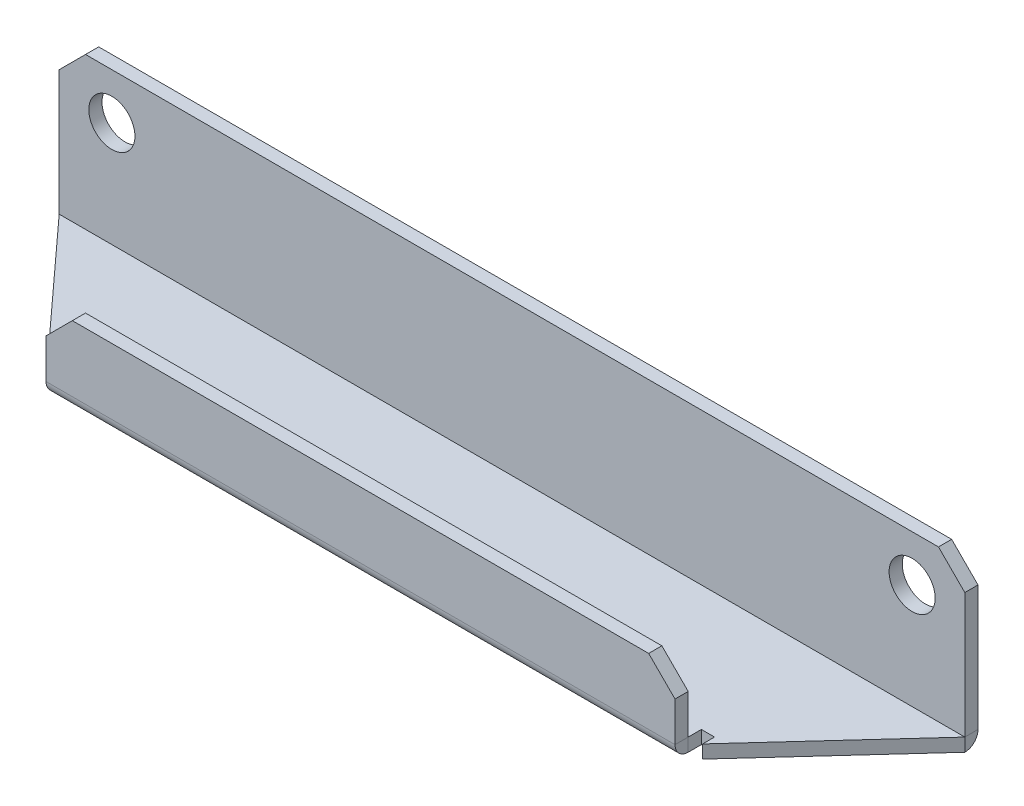
ISO-10303-21;
HEADER;
FILE_DESCRIPTION(('STEP AP214'),'2;1');
FILE_NAME('part.step','',(''),(''),'','','');
FILE_SCHEMA(('AUTOMOTIVE_DESIGN { 1 0 10303 214 1 1 1 1 }'));
ENDSEC;
DATA;
#1=APPLICATION_CONTEXT('core data for automotive mechanical design processes');
#2=APPLICATION_PROTOCOL_DEFINITION('international standard','automotive_design',2000,#1);
#3=PRODUCT_CONTEXT('',#1,'mechanical');
#4=PRODUCT('Part','Part','',(#3));
#5=PRODUCT_RELATED_PRODUCT_CATEGORY('part','',(#4));
#6=PRODUCT_DEFINITION_FORMATION('','',#4);
#7=PRODUCT_DEFINITION_CONTEXT('part definition',#1,'design');
#8=PRODUCT_DEFINITION('design','',#6,#7);
#9=PRODUCT_DEFINITION_SHAPE('','',#8);
#10=(LENGTH_UNIT() NAMED_UNIT(*) SI_UNIT(.MILLI.,.METRE.));
#11=(NAMED_UNIT(*) PLANE_ANGLE_UNIT() SI_UNIT($,.RADIAN.));
#12=(NAMED_UNIT(*) SI_UNIT($,.STERADIAN.) SOLID_ANGLE_UNIT());
#13=UNCERTAINTY_MEASURE_WITH_UNIT(LENGTH_MEASURE(1.E-05),#10,'distance_accuracy_value','');
#14=(GEOMETRIC_REPRESENTATION_CONTEXT(3) GLOBAL_UNCERTAINTY_ASSIGNED_CONTEXT((#13)) GLOBAL_UNIT_ASSIGNED_CONTEXT((#10,
#11,#12)) REPRESENTATION_CONTEXT('',''));
#15=CARTESIAN_POINT('',(0.,0.,0.));
#16=DIRECTION('',(0.,0.,1.));
#17=DIRECTION('',(1.,0.,0.));
#18=AXIS2_PLACEMENT_3D('',#15,#16,#17);
#19=CARTESIAN_POINT('',(-68.75,0.,0.));
#20=DIRECTION('',(0.738485493928126,0.,-0.674269364021332));
#21=DIRECTION('',(-0.674269364021332,0.,-0.738485493928126));
#22=AXIS2_PLACEMENT_3D('',#19,#20,#21);
#23=PLANE('',#22);
#24=DIRECTION('',(0.,-1.,0.));
#25=VECTOR('',#24,1.);
#26=CARTESIAN_POINT('',(-49.75,1.99999999999993,20.8095238095238));
#27=LINE('',#26,#25);
#28=CARTESIAN_POINT('',(-49.75,1.99999999999993,20.8095238095238));
#29=VERTEX_POINT('',#28);
#30=CARTESIAN_POINT('',(-49.75,0.,20.8095238095238));
#31=VERTEX_POINT('',#30);
#32=EDGE_CURVE('E310',#29,#31,#27,.T.);
#33=ORIENTED_EDGE('',*,*,#32,.F.);
#34=DIRECTION('',(-0.674269364021332,0.,-0.738485493928126));
#35=VECTOR('',#34,1.);
#36=CARTESIAN_POINT('',(-68.75,2.,0.));
#37=LINE('',#36,#35);
#38=CARTESIAN_POINT('',(-68.75,2.,0.));
#39=VERTEX_POINT('',#38);
#40=EDGE_CURVE('E331',#29,#39,#37,.T.);
#41=ORIENTED_EDGE('',*,*,#40,.T.);
#42=DIRECTION('',(0.,1.,0.));
#43=VECTOR('',#42,1.);
#44=CARTESIAN_POINT('',(-68.75,0.,0.));
#45=LINE('',#44,#43);
#46=CARTESIAN_POINT('',(-68.75,0.,0.));
#47=VERTEX_POINT('',#46);
#48=EDGE_CURVE('E332',#47,#39,#45,.T.);
#49=ORIENTED_EDGE('',*,*,#48,.F.);
#50=DIRECTION('',(0.674269364021332,0.,0.738485493928126));
#51=VECTOR('',#50,1.);
#52=CARTESIAN_POINT('',(-37.4935567010309,-1.19524744544288E-13,34.2332474226804));
#53=LINE('',#52,#51);
#54=EDGE_CURVE('E344',#31,#47,#53,.F.);
#55=ORIENTED_EDGE('',*,*,#54,.F.);
#56=EDGE_LOOP('',(#33,#41,#49,#55));
#57=FACE_BOUND('',#56,.T.);
#58=ADVANCED_FACE('F85',(#57),#23,.F.);
#59=CARTESIAN_POINT('',(68.75,0.,0.));
#60=DIRECTION('',(-0.738485493928126,0.,-0.674269364021332));
#61=DIRECTION('',(-0.674269364021332,0.,0.738485493928126));
#62=AXIS2_PLACEMENT_3D('',#59,#60,#61);
#63=PLANE('',#62);
#64=DIRECTION('',(0.,-1.,0.));
#65=VECTOR('',#64,1.);
#66=CARTESIAN_POINT('',(49.75,1.99999999999993,20.8095238095238));
#67=LINE('',#66,#65);
#68=CARTESIAN_POINT('',(49.75,1.99999999999993,20.8095238095238));
#69=VERTEX_POINT('',#68);
#70=CARTESIAN_POINT('',(49.75,0.,20.8095238095238));
#71=VERTEX_POINT('',#70);
#72=EDGE_CURVE('E291',#69,#71,#67,.T.);
#73=ORIENTED_EDGE('',*,*,#72,.T.);
#74=DIRECTION('',(0.674269364021332,0.,-0.738485493928126));
#75=VECTOR('',#74,1.);
#76=CARTESIAN_POINT('',(37.4935567010309,-1.19524744544288E-13,34.2332474226804));
#77=LINE('',#76,#75);
#78=CARTESIAN_POINT('',(68.75,0.,0.));
#79=VERTEX_POINT('',#78);
#80=EDGE_CURVE('E339',#79,#71,#77,.F.);
#81=ORIENTED_EDGE('',*,*,#80,.F.);
#82=DIRECTION('',(0.,1.,0.));
#83=VECTOR('',#82,1.);
#84=CARTESIAN_POINT('',(68.75,0.,0.));
#85=LINE('',#84,#83);
#86=CARTESIAN_POINT('',(68.75,2.,0.));
#87=VERTEX_POINT('',#86);
#88=EDGE_CURVE('E336',#79,#87,#85,.T.);
#89=ORIENTED_EDGE('',*,*,#88,.T.);
#90=DIRECTION('',(-0.674269364021332,0.,0.738485493928126));
#91=VECTOR('',#90,1.);
#92=CARTESIAN_POINT('',(68.75,2.,0.));
#93=LINE('',#92,#91);
#94=EDGE_CURVE('E346',#87,#69,#93,.T.);
#95=ORIENTED_EDGE('',*,*,#94,.T.);
#96=EDGE_LOOP('',(#73,#81,#89,#95));
#97=FACE_BOUND('',#96,.T.);
#98=ADVANCED_FACE('F426',(#97),#63,.F.);
#99=CARTESIAN_POINT('',(0.,0.,0.));
#100=DIRECTION('',(0.,-1.,0.));
#101=DIRECTION('',(0.,0.,-1.));
#102=AXIS2_PLACEMENT_3D('',#99,#100,#101);
#103=PLANE('',#102);
#104=ORIENTED_EDGE('',*,*,#80,.T.);
#105=DIRECTION('',(0.,0.,-1.));
#106=VECTOR('',#105,1.);
#107=CARTESIAN_POINT('',(49.75,0.,0.));
#108=LINE('',#107,#106);
#109=CARTESIAN_POINT('',(49.75,0.,19.));
#110=VERTEX_POINT('',#109);
#111=EDGE_CURVE('E102',#71,#110,#108,.T.);
#112=ORIENTED_EDGE('',*,*,#111,.T.);
#113=DIRECTION('',(-1.,0.,0.));
#114=VECTOR('',#113,1.);
#115=CARTESIAN_POINT('',(0.,0.,19.));
#116=LINE('',#115,#114);
#117=CARTESIAN_POINT('',(47.75,0.,19.));
#118=VERTEX_POINT('',#117);
#119=EDGE_CURVE('E106',#110,#118,#116,.T.);
#120=ORIENTED_EDGE('',*,*,#119,.T.);
#121=DIRECTION('',(0.,0.,1.));
#122=VECTOR('',#121,1.);
#123=CARTESIAN_POINT('',(47.75,0.,0.));
#124=LINE('',#123,#122);
#125=CARTESIAN_POINT('',(47.75,0.,21.));
#126=VERTEX_POINT('',#125);
#127=EDGE_CURVE('E327',#118,#126,#124,.T.);
#128=ORIENTED_EDGE('',*,*,#127,.T.);
#129=DIRECTION('',(1.,0.,0.));
#130=VECTOR('',#129,1.);
#131=CARTESIAN_POINT('',(0.,0.,21.));
#132=LINE('',#131,#130);
#133=CARTESIAN_POINT('',(-47.75,0.,21.));
#134=VERTEX_POINT('',#133);
#135=EDGE_CURVE('E275',#134,#126,#132,.T.);
#136=ORIENTED_EDGE('',*,*,#135,.F.);
#137=DIRECTION('',(0.,0.,-1.));
#138=VECTOR('',#137,1.);
#139=CARTESIAN_POINT('',(-47.75,0.,0.));
#140=LINE('',#139,#138);
#141=CARTESIAN_POINT('',(-47.75,0.,19.));
#142=VERTEX_POINT('',#141);
#143=EDGE_CURVE('E325',#134,#142,#140,.T.);
#144=ORIENTED_EDGE('',*,*,#143,.T.);
#145=DIRECTION('',(-1.,0.,0.));
#146=VECTOR('',#145,1.);
#147=CARTESIAN_POINT('',(0.,0.,19.));
#148=LINE('',#147,#146);
#149=CARTESIAN_POINT('',(-49.75,0.,19.));
#150=VERTEX_POINT('',#149);
#151=EDGE_CURVE('E323',#142,#150,#148,.T.);
#152=ORIENTED_EDGE('',*,*,#151,.T.);
#153=DIRECTION('',(0.,0.,1.));
#154=VECTOR('',#153,1.);
#155=CARTESIAN_POINT('',(-49.75,0.,0.));
#156=LINE('',#155,#154);
#157=EDGE_CURVE('E290',#150,#31,#156,.T.);
#158=ORIENTED_EDGE('',*,*,#157,.T.);
#159=ORIENTED_EDGE('',*,*,#54,.T.);
#160=DIRECTION('',(-1.,0.,0.));
#161=VECTOR('',#160,1.);
#162=CARTESIAN_POINT('',(0.,0.,0.));
#163=LINE('',#162,#161);
#164=EDGE_CURVE('E341',#47,#79,#163,.F.);
#165=ORIENTED_EDGE('',*,*,#164,.T.);
#166=EDGE_LOOP('',(#104,#112,#120,#128,#136,#144,#152,#158,#159,#165));
#167=FACE_BOUND('',#166,.T.);
#168=ADVANCED_FACE('F434',(#167),#103,.T.);
#169=CARTESIAN_POINT('',(0.,2.,0.));
#170=DIRECTION('',(0.,-1.,0.));
#171=DIRECTION('',(0.,0.,-1.));
#172=AXIS2_PLACEMENT_3D('',#169,#170,#171);
#173=PLANE('',#172);
#174=DIRECTION('',(0.,0.,-1.));
#175=VECTOR('',#174,1.);
#176=CARTESIAN_POINT('',(49.75,1.99999999999993,20.8095238095238));
#177=LINE('',#176,#175);
#178=CARTESIAN_POINT('',(49.75,1.99999999999993,19.));
#179=VERTEX_POINT('',#178);
#180=EDGE_CURVE('E287',#69,#179,#177,.T.);
#181=ORIENTED_EDGE('',*,*,#180,.F.);
#182=ORIENTED_EDGE('',*,*,#94,.F.);
#183=DIRECTION('',(1.,0.,0.));
#184=VECTOR('',#183,1.);
#185=CARTESIAN_POINT('',(-68.75,2.,0.));
#186=LINE('',#185,#184);
#187=EDGE_CURVE('E349',#39,#87,#186,.T.);
#188=ORIENTED_EDGE('',*,*,#187,.F.);
#189=ORIENTED_EDGE('',*,*,#40,.F.);
#190=DIRECTION('',(0.,0.,1.));
#191=VECTOR('',#190,1.);
#192=CARTESIAN_POINT('',(-49.75,1.99999999999993,19.));
#193=LINE('',#192,#191);
#194=CARTESIAN_POINT('',(-49.75,1.99999999999993,19.));
#195=VERTEX_POINT('',#194);
#196=EDGE_CURVE('E307',#195,#29,#193,.T.);
#197=ORIENTED_EDGE('',*,*,#196,.F.);
#198=DIRECTION('',(-1.,0.,0.));
#199=VECTOR('',#198,1.);
#200=CARTESIAN_POINT('',(-47.75,1.99999999999993,19.));
#201=LINE('',#200,#199);
#202=CARTESIAN_POINT('',(-47.75,1.99999999999993,19.));
#203=VERTEX_POINT('',#202);
#204=EDGE_CURVE('E303',#203,#195,#201,.T.);
#205=ORIENTED_EDGE('',*,*,#204,.F.);
#206=DIRECTION('',(0.,0.,-1.));
#207=VECTOR('',#206,1.);
#208=CARTESIAN_POINT('',(-47.75,1.99999999999993,21.));
#209=LINE('',#208,#207);
#210=CARTESIAN_POINT('',(-47.75,1.99999999999993,21.));
#211=VERTEX_POINT('',#210);
#212=EDGE_CURVE('E300',#211,#203,#209,.T.);
#213=ORIENTED_EDGE('',*,*,#212,.F.);
#214=DIRECTION('',(-1.,0.,0.));
#215=VECTOR('',#214,1.);
#216=CARTESIAN_POINT('',(47.75,1.99999999999993,21.));
#217=LINE('',#216,#215);
#218=CARTESIAN_POINT('',(47.75,1.99999999999993,21.));
#219=VERTEX_POINT('',#218);
#220=EDGE_CURVE('E260',#211,#219,#217,.F.);
#221=ORIENTED_EDGE('',*,*,#220,.T.);
#222=DIRECTION('',(0.,0.,1.));
#223=VECTOR('',#222,1.);
#224=CARTESIAN_POINT('',(47.75,1.99999999999993,19.));
#225=LINE('',#224,#223);
#226=CARTESIAN_POINT('',(47.75,1.99999999999993,19.));
#227=VERTEX_POINT('',#226);
#228=EDGE_CURVE('E296',#227,#219,#225,.T.);
#229=ORIENTED_EDGE('',*,*,#228,.F.);
#230=DIRECTION('',(-1.,0.,0.));
#231=VECTOR('',#230,1.);
#232=CARTESIAN_POINT('',(49.75,1.99999999999993,19.));
#233=LINE('',#232,#231);
#234=EDGE_CURVE('E292',#179,#227,#233,.T.);
#235=ORIENTED_EDGE('',*,*,#234,.F.);
#236=EDGE_LOOP('',(#181,#182,#188,#189,#197,#205,#213,#221,#229,#235));
#237=FACE_BOUND('',#236,.T.);
#238=ADVANCED_FACE('F430',(#237),#173,.F.);
#239=CARTESIAN_POINT('',(68.75,0.,-2.));
#240=DIRECTION('',(1.,0.,0.));
#241=DIRECTION('',(0.,0.,-1.));
#242=AXIS2_PLACEMENT_3D('',#239,#240,#241);
#243=PLANE('',#242);
#244=DIRECTION('',(0.,1.,0.));
#245=VECTOR('',#244,1.);
#246=CARTESIAN_POINT('',(68.75,0.,0.));
#247=LINE('',#246,#245);
#248=CARTESIAN_POINT('',(68.75,21.,0.));
#249=VERTEX_POINT('',#248);
#250=EDGE_CURVE('E394',#87,#249,#247,.T.);
#251=ORIENTED_EDGE('',*,*,#250,.F.);
#252=DIRECTION('',(0.,0.,1.));
#253=VECTOR('',#252,1.);
#254=CARTESIAN_POINT('',(68.75,2.00000000000001,-2.));
#255=LINE('',#254,#253);
#256=CARTESIAN_POINT('',(68.75,2.00000000000001,-2.));
#257=VERTEX_POINT('',#256);
#258=EDGE_CURVE('E335',#257,#87,#255,.T.);
#259=ORIENTED_EDGE('',*,*,#258,.F.);
#260=DIRECTION('',(0.,1.,0.));
#261=VECTOR('',#260,1.);
#262=CARTESIAN_POINT('',(68.75,0.,-2.));
#263=LINE('',#262,#261);
#264=CARTESIAN_POINT('',(68.75,21.,-2.));
#265=VERTEX_POINT('',#264);
#266=EDGE_CURVE('E380',#257,#265,#263,.T.);
#267=ORIENTED_EDGE('',*,*,#266,.T.);
#268=DIRECTION('',(0.,0.,1.));
#269=VECTOR('',#268,1.);
#270=CARTESIAN_POINT('',(68.75,21.,-2.));
#271=LINE('',#270,#269);
#272=EDGE_CURVE('E89',#265,#249,#271,.T.);
#273=ORIENTED_EDGE('',*,*,#272,.T.);
#274=EDGE_LOOP('',(#251,#259,#267,#273));
#275=FACE_BOUND('',#274,.T.);
#276=ADVANCED_FACE('F412',(#275),#243,.T.);
#277=CARTESIAN_POINT('',(0.,0.,-2.));
#278=DIRECTION('',(0.,0.,-1.));
#279=DIRECTION('',(-1.,0.,0.));
#280=AXIS2_PLACEMENT_3D('',#277,#278,#279);
#281=PLANE('',#280);
#282=CARTESIAN_POINT('',(-60.75,18.,-2.));
#283=DIRECTION('',(0.,0.,1.));
#284=DIRECTION('',(1.,0.,0.));
#285=AXIS2_PLACEMENT_3D('',#282,#283,#284);
#286=CIRCLE('',#285,3.5);
#287=CARTESIAN_POINT('',(-57.25,18.,-2.));
#288=VERTEX_POINT('',#287);
#289=EDGE_CURVE('E372',#288,#288,#286,.T.);
#290=ORIENTED_EDGE('',*,*,#289,.T.);
#291=EDGE_LOOP('',(#290));
#292=FACE_BOUND('',#291,.T.);
#293=CARTESIAN_POINT('',(60.75,18.,-2.));
#294=DIRECTION('',(0.,0.,1.));
#295=DIRECTION('',(1.,0.,0.));
#296=AXIS2_PLACEMENT_3D('',#293,#294,#295);
#297=CIRCLE('',#296,3.5);
#298=CARTESIAN_POINT('',(64.25,18.,-2.));
#299=VERTEX_POINT('',#298);
#300=EDGE_CURVE('E366',#299,#299,#297,.T.);
#301=ORIENTED_EDGE('',*,*,#300,.T.);
#302=EDGE_LOOP('',(#301));
#303=FACE_BOUND('',#302,.T.);
#304=ORIENTED_EDGE('',*,*,#266,.F.);
#305=DIRECTION('',(-1.,0.,0.));
#306=VECTOR('',#305,1.);
#307=CARTESIAN_POINT('',(0.,2.00000000000001,-2.));
#308=LINE('',#307,#306);
#309=CARTESIAN_POINT('',(-68.75,2.00000000000002,-2.));
#310=VERTEX_POINT('',#309);
#311=EDGE_CURVE('E354',#310,#257,#308,.F.);
#312=ORIENTED_EDGE('',*,*,#311,.F.);
#313=DIRECTION('',(0.,-1.,0.));
#314=VECTOR('',#313,1.);
#315=CARTESIAN_POINT('',(-68.75,0.,-2.));
#316=LINE('',#315,#314);
#317=CARTESIAN_POINT('',(-68.75,21.,-2.));
#318=VERTEX_POINT('',#317);
#319=EDGE_CURVE('E378',#318,#310,#316,.T.);
#320=ORIENTED_EDGE('',*,*,#319,.F.);
#321=DIRECTION('',(-0.707106781186548,-0.707106781186547,0.));
#322=VECTOR('',#321,1.);
#323=CARTESIAN_POINT('',(-68.75,21.,-2.));
#324=LINE('',#323,#322);
#325=CARTESIAN_POINT('',(-64.75,25.,-2.));
#326=VERTEX_POINT('',#325);
#327=EDGE_CURVE('E389',#326,#318,#324,.T.);
#328=ORIENTED_EDGE('',*,*,#327,.F.);
#329=DIRECTION('',(-1.,0.,0.));
#330=VECTOR('',#329,1.);
#331=CARTESIAN_POINT('',(-64.75,25.,-2.));
#332=LINE('',#331,#330);
#333=CARTESIAN_POINT('',(64.75,25.,-2.));
#334=VERTEX_POINT('',#333);
#335=EDGE_CURVE('E386',#334,#326,#332,.T.);
#336=ORIENTED_EDGE('',*,*,#335,.F.);
#337=DIRECTION('',(-0.707106781186548,0.707106781186547,0.));
#338=VECTOR('',#337,1.);
#339=CARTESIAN_POINT('',(68.75,21.,-2.));
#340=LINE('',#339,#338);
#341=EDGE_CURVE('E383',#265,#334,#340,.T.);
#342=ORIENTED_EDGE('',*,*,#341,.F.);
#343=EDGE_LOOP('',(#304,#312,#320,#328,#336,#342));
#344=FACE_BOUND('',#343,.T.);
#345=ADVANCED_FACE('F451',(#292,#303,#344),#281,.T.);
#346=CARTESIAN_POINT('',(0.,0.,0.));
#347=DIRECTION('',(0.,0.,-1.));
#348=DIRECTION('',(-1.,0.,0.));
#349=AXIS2_PLACEMENT_3D('',#346,#347,#348);
#350=PLANE('',#349);
#351=CARTESIAN_POINT('',(-60.75,18.,0.));
#352=DIRECTION('',(0.,0.,1.));
#353=DIRECTION('',(1.,0.,0.));
#354=AXIS2_PLACEMENT_3D('',#351,#352,#353);
#355=CIRCLE('',#354,3.5);
#356=CARTESIAN_POINT('',(-57.25,18.,0.));
#357=VERTEX_POINT('',#356);
#358=EDGE_CURVE('E369',#357,#357,#355,.T.);
#359=ORIENTED_EDGE('',*,*,#358,.F.);
#360=EDGE_LOOP('',(#359));
#361=FACE_BOUND('',#360,.T.);
#362=CARTESIAN_POINT('',(60.75,18.,0.));
#363=DIRECTION('',(0.,0.,1.));
#364=DIRECTION('',(1.,0.,0.));
#365=AXIS2_PLACEMENT_3D('',#362,#363,#364);
#366=CIRCLE('',#365,3.5);
#367=CARTESIAN_POINT('',(64.25,18.,0.));
#368=VERTEX_POINT('',#367);
#369=EDGE_CURVE('E365',#368,#368,#366,.T.);
#370=ORIENTED_EDGE('',*,*,#369,.F.);
#371=EDGE_LOOP('',(#370));
#372=FACE_BOUND('',#371,.T.);
#373=ORIENTED_EDGE('',*,*,#187,.T.);
#374=ORIENTED_EDGE('',*,*,#250,.T.);
#375=DIRECTION('',(-0.707106781186548,0.707106781186547,0.));
#376=VECTOR('',#375,1.);
#377=CARTESIAN_POINT('',(68.75,21.,0.));
#378=LINE('',#377,#376);
#379=CARTESIAN_POINT('',(64.75,25.,0.));
#380=VERTEX_POINT('',#379);
#381=EDGE_CURVE('E396',#249,#380,#378,.T.);
#382=ORIENTED_EDGE('',*,*,#381,.T.);
#383=DIRECTION('',(-1.,0.,0.));
#384=VECTOR('',#383,1.);
#385=CARTESIAN_POINT('',(-64.75,25.,0.));
#386=LINE('',#385,#384);
#387=CARTESIAN_POINT('',(-64.75,25.,0.));
#388=VERTEX_POINT('',#387);
#389=EDGE_CURVE('E399',#380,#388,#386,.T.);
#390=ORIENTED_EDGE('',*,*,#389,.T.);
#391=DIRECTION('',(-0.707106781186548,-0.707106781186547,0.));
#392=VECTOR('',#391,1.);
#393=CARTESIAN_POINT('',(-68.75,21.,0.));
#394=LINE('',#393,#392);
#395=CARTESIAN_POINT('',(-68.75,21.,0.));
#396=VERTEX_POINT('',#395);
#397=EDGE_CURVE('E381',#388,#396,#394,.T.);
#398=ORIENTED_EDGE('',*,*,#397,.T.);
#399=DIRECTION('',(0.,-1.,0.));
#400=VECTOR('',#399,1.);
#401=CARTESIAN_POINT('',(-68.75,0.,0.));
#402=LINE('',#401,#400);
#403=EDGE_CURVE('E375',#396,#39,#402,.T.);
#404=ORIENTED_EDGE('',*,*,#403,.T.);
#405=EDGE_LOOP('',(#373,#374,#382,#390,#398,#404));
#406=FACE_BOUND('',#405,.T.);
#407=ADVANCED_FACE('F417',(#361,#372,#406),#350,.F.);
#408=CARTESIAN_POINT('',(-68.75,0.,-2.));
#409=DIRECTION('',(-1.,0.,0.));
#410=DIRECTION('',(0.,0.,1.));
#411=AXIS2_PLACEMENT_3D('',#408,#409,#410);
#412=PLANE('',#411);
#413=DIRECTION('',(0.,0.,1.));
#414=VECTOR('',#413,1.);
#415=CARTESIAN_POINT('',(-68.75,2.00000000000001,-2.));
#416=LINE('',#415,#414);
#417=EDGE_CURVE('E357',#310,#39,#416,.T.);
#418=ORIENTED_EDGE('',*,*,#417,.T.);
#419=ORIENTED_EDGE('',*,*,#403,.F.);
#420=DIRECTION('',(0.,0.,1.));
#421=VECTOR('',#420,1.);
#422=CARTESIAN_POINT('',(-68.75,21.,-2.));
#423=LINE('',#422,#421);
#424=EDGE_CURVE('E13',#318,#396,#423,.T.);
#425=ORIENTED_EDGE('',*,*,#424,.F.);
#426=ORIENTED_EDGE('',*,*,#319,.T.);
#427=EDGE_LOOP('',(#418,#419,#425,#426));
#428=FACE_BOUND('',#427,.T.);
#429=ADVANCED_FACE('F87',(#428),#412,.T.);
#430=CARTESIAN_POINT('',(-68.75,21.,-2.));
#431=DIRECTION('',(-0.707106781186547,0.707106781186548,0.));
#432=DIRECTION('',(-0.707106781186548,-0.707106781186547,0.));
#433=AXIS2_PLACEMENT_3D('',#430,#431,#432);
#434=PLANE('',#433);
#435=ORIENTED_EDGE('',*,*,#397,.F.);
#436=DIRECTION('',(0.,0.,1.));
#437=VECTOR('',#436,1.);
#438=CARTESIAN_POINT('',(-64.75,25.,-2.));
#439=LINE('',#438,#437);
#440=EDGE_CURVE('E94',#326,#388,#439,.T.);
#441=ORIENTED_EDGE('',*,*,#440,.F.);
#442=ORIENTED_EDGE('',*,*,#327,.T.);
#443=ORIENTED_EDGE('',*,*,#424,.T.);
#444=EDGE_LOOP('',(#435,#441,#442,#443));
#445=FACE_BOUND('',#444,.T.);
#446=ADVANCED_FACE('F503',(#445),#434,.T.);
#447=CARTESIAN_POINT('',(-64.75,25.,-2.));
#448=DIRECTION('',(0.,1.,0.));
#449=DIRECTION('',(0.,0.,1.));
#450=AXIS2_PLACEMENT_3D('',#447,#448,#449);
#451=PLANE('',#450);
#452=ORIENTED_EDGE('',*,*,#389,.F.);
#453=DIRECTION('',(0.,0.,1.));
#454=VECTOR('',#453,1.);
#455=CARTESIAN_POINT('',(64.75,25.,-2.));
#456=LINE('',#455,#454);
#457=EDGE_CURVE('E404',#334,#380,#456,.T.);
#458=ORIENTED_EDGE('',*,*,#457,.F.);
#459=ORIENTED_EDGE('',*,*,#335,.T.);
#460=ORIENTED_EDGE('',*,*,#440,.T.);
#461=EDGE_LOOP('',(#452,#458,#459,#460));
#462=FACE_BOUND('',#461,.T.);
#463=ADVANCED_FACE('F500',(#462),#451,.T.);
#464=CARTESIAN_POINT('',(68.75,21.,-2.));
#465=DIRECTION('',(0.707106781186547,0.707106781186548,0.));
#466=DIRECTION('',(-0.707106781186548,0.707106781186547,0.));
#467=AXIS2_PLACEMENT_3D('',#464,#465,#466);
#468=PLANE('',#467);
#469=ORIENTED_EDGE('',*,*,#381,.F.);
#470=ORIENTED_EDGE('',*,*,#272,.F.);
#471=ORIENTED_EDGE('',*,*,#341,.T.);
#472=ORIENTED_EDGE('',*,*,#457,.T.);
#473=EDGE_LOOP('',(#469,#470,#471,#472));
#474=FACE_BOUND('',#473,.T.);
#475=ADVANCED_FACE('F415',(#474),#468,.T.);
#476=CARTESIAN_POINT('',(-60.75,18.,-2.));
#477=DIRECTION('',(0.,0.,1.));
#478=DIRECTION('',(1.,0.,0.));
#479=AXIS2_PLACEMENT_3D('',#476,#477,#478);
#480=CYLINDRICAL_SURFACE('',#479,3.5);
#481=ORIENTED_EDGE('',*,*,#289,.F.);
#482=EDGE_LOOP('',(#481));
#483=FACE_BOUND('',#482,.T.);
#484=ORIENTED_EDGE('',*,*,#358,.T.);
#485=EDGE_LOOP('',(#484));
#486=FACE_BOUND('',#485,.T.);
#487=ADVANCED_FACE('F462',(#483,#486),#480,.F.);
#488=CARTESIAN_POINT('',(60.75,18.,-2.));
#489=DIRECTION('',(0.,0.,1.));
#490=DIRECTION('',(1.,0.,0.));
#491=AXIS2_PLACEMENT_3D('',#488,#489,#490);
#492=CYLINDRICAL_SURFACE('',#491,3.5);
#493=ORIENTED_EDGE('',*,*,#300,.F.);
#494=EDGE_LOOP('',(#493));
#495=FACE_BOUND('',#494,.T.);
#496=ORIENTED_EDGE('',*,*,#369,.T.);
#497=EDGE_LOOP('',(#496));
#498=FACE_BOUND('',#497,.T.);
#499=ADVANCED_FACE('F455',(#495,#498),#492,.F.);
#500=CARTESIAN_POINT('',(68.75,2.00000000000001,-2.));
#501=DIRECTION('',(1.,0.,0.));
#502=DIRECTION('',(0.,0.,-1.));
#503=AXIS2_PLACEMENT_3D('',#500,#501,#502);
#504=PLANE('',#503);
#505=CARTESIAN_POINT('',(68.75,2.,0.));
#506=DIRECTION('',(-1.,0.,0.));
#507=DIRECTION('',(0.,0.,1.));
#508=AXIS2_PLACEMENT_3D('',#505,#506,#507);
#509=CIRCLE('',#508,2.);
#510=EDGE_CURVE('E363',#257,#79,#509,.T.);
#511=ORIENTED_EDGE('',*,*,#510,.F.);
#512=ORIENTED_EDGE('',*,*,#258,.T.);
#513=ORIENTED_EDGE('',*,*,#88,.F.);
#514=EDGE_LOOP('',(#511,#512,#513));
#515=FACE_BOUND('',#514,.T.);
#516=ADVANCED_FACE('F453',(#515),#504,.T.);
#517=CARTESIAN_POINT('',(-68.75,2.,0.));
#518=DIRECTION('',(-1.,0.,0.));
#519=DIRECTION('',(0.,0.,1.));
#520=AXIS2_PLACEMENT_3D('',#517,#518,#519);
#521=CYLINDRICAL_SURFACE('',#520,2.);
#522=CARTESIAN_POINT('',(-68.75,2.,0.));
#523=DIRECTION('',(-1.,0.,0.));
#524=DIRECTION('',(0.,0.,1.));
#525=AXIS2_PLACEMENT_3D('',#522,#523,#524);
#526=CIRCLE('',#525,2.);
#527=EDGE_CURVE('E360',#310,#47,#526,.T.);
#528=ORIENTED_EDGE('',*,*,#527,.F.);
#529=ORIENTED_EDGE('',*,*,#311,.T.);
#530=ORIENTED_EDGE('',*,*,#510,.T.);
#531=ORIENTED_EDGE('',*,*,#164,.F.);
#532=EDGE_LOOP('',(#528,#529,#530,#531));
#533=FACE_BOUND('',#532,.T.);
#534=ADVANCED_FACE('F440',(#533),#521,.T.);
#535=CARTESIAN_POINT('',(-68.75,2.00000000000001,-2.));
#536=DIRECTION('',(1.,0.,0.));
#537=DIRECTION('',(0.,0.,-1.));
#538=AXIS2_PLACEMENT_3D('',#535,#536,#537);
#539=PLANE('',#538);
#540=ORIENTED_EDGE('',*,*,#417,.F.);
#541=ORIENTED_EDGE('',*,*,#527,.T.);
#542=ORIENTED_EDGE('',*,*,#48,.T.);
#543=EDGE_LOOP('',(#540,#541,#542));
#544=FACE_BOUND('',#543,.T.);
#545=ADVANCED_FACE('F445',(#544),#539,.F.);
#546=CARTESIAN_POINT('',(49.75,1.99999999999993,20.8095238095238));
#547=DIRECTION('',(-1.,0.,0.));
#548=DIRECTION('',(0.,0.,1.));
#549=AXIS2_PLACEMENT_3D('',#546,#547,#548);
#550=PLANE('',#549);
#551=ORIENTED_EDGE('',*,*,#111,.F.);
#552=ORIENTED_EDGE('',*,*,#72,.F.);
#553=ORIENTED_EDGE('',*,*,#180,.T.);
#554=DIRECTION('',(0.,-1.,0.));
#555=VECTOR('',#554,1.);
#556=CARTESIAN_POINT('',(49.75,1.99999999999993,19.));
#557=LINE('',#556,#555);
#558=EDGE_CURVE('E295',#179,#110,#557,.T.);
#559=ORIENTED_EDGE('',*,*,#558,.T.);
#560=EDGE_LOOP('',(#551,#552,#553,#559));
#561=FACE_BOUND('',#560,.T.);
#562=ADVANCED_FACE('F433',(#561),#550,.T.);
#563=CARTESIAN_POINT('',(49.75,1.99999999999993,19.));
#564=DIRECTION('',(0.,0.,1.));
#565=DIRECTION('',(0.,-1.,0.));
#566=AXIS2_PLACEMENT_3D('',#563,#564,#565);
#567=PLANE('',#566);
#568=ORIENTED_EDGE('',*,*,#119,.F.);
#569=ORIENTED_EDGE('',*,*,#558,.F.);
#570=ORIENTED_EDGE('',*,*,#234,.T.);
#571=DIRECTION('',(0.,-1.,0.));
#572=VECTOR('',#571,1.);
#573=CARTESIAN_POINT('',(47.75,1.99999999999993,19.));
#574=LINE('',#573,#572);
#575=EDGE_CURVE('E299',#227,#118,#574,.T.);
#576=ORIENTED_EDGE('',*,*,#575,.T.);
#577=EDGE_LOOP('',(#568,#569,#570,#576));
#578=FACE_BOUND('',#577,.T.);
#579=ADVANCED_FACE('F477',(#578),#567,.T.);
#580=CARTESIAN_POINT('',(47.75,1.99999999999993,19.));
#581=DIRECTION('',(1.,0.,0.));
#582=DIRECTION('',(0.,0.,-1.));
#583=AXIS2_PLACEMENT_3D('',#580,#581,#582);
#584=PLANE('',#583);
#585=ORIENTED_EDGE('',*,*,#127,.F.);
#586=ORIENTED_EDGE('',*,*,#575,.F.);
#587=ORIENTED_EDGE('',*,*,#228,.T.);
#588=DIRECTION('',(0.,1.,0.));
#589=VECTOR('',#588,1.);
#590=CARTESIAN_POINT('',(47.75,0.,21.));
#591=LINE('',#590,#589);
#592=EDGE_CURVE('E273',#126,#219,#591,.T.);
#593=ORIENTED_EDGE('',*,*,#592,.F.);
#594=EDGE_LOOP('',(#585,#586,#587,#593));
#595=FACE_BOUND('',#594,.T.);
#596=ADVANCED_FACE('F482',(#595),#584,.T.);
#597=CARTESIAN_POINT('',(-47.75,1.99999999999993,21.));
#598=DIRECTION('',(-1.,0.,0.));
#599=DIRECTION('',(0.,0.,1.));
#600=AXIS2_PLACEMENT_3D('',#597,#598,#599);
#601=PLANE('',#600);
#602=ORIENTED_EDGE('',*,*,#143,.F.);
#603=DIRECTION('',(0.,1.,0.));
#604=VECTOR('',#603,1.);
#605=CARTESIAN_POINT('',(-47.75,0.,21.));
#606=LINE('',#605,#604);
#607=EDGE_CURVE('E279',#134,#211,#606,.T.);
#608=ORIENTED_EDGE('',*,*,#607,.T.);
#609=ORIENTED_EDGE('',*,*,#212,.T.);
#610=DIRECTION('',(0.,-1.,0.));
#611=VECTOR('',#610,1.);
#612=CARTESIAN_POINT('',(-47.75,1.99999999999993,19.));
#613=LINE('',#612,#611);
#614=EDGE_CURVE('E306',#203,#142,#613,.T.);
#615=ORIENTED_EDGE('',*,*,#614,.T.);
#616=EDGE_LOOP('',(#602,#608,#609,#615));
#617=FACE_BOUND('',#616,.T.);
#618=ADVANCED_FACE('F614',(#617),#601,.T.);
#619=CARTESIAN_POINT('',(-47.75,1.99999999999993,19.));
#620=DIRECTION('',(0.,0.,1.));
#621=DIRECTION('',(0.,-1.,0.));
#622=AXIS2_PLACEMENT_3D('',#619,#620,#621);
#623=PLANE('',#622);
#624=ORIENTED_EDGE('',*,*,#151,.F.);
#625=ORIENTED_EDGE('',*,*,#614,.F.);
#626=ORIENTED_EDGE('',*,*,#204,.T.);
#627=DIRECTION('',(0.,-1.,0.));
#628=VECTOR('',#627,1.);
#629=CARTESIAN_POINT('',(-49.75,1.99999999999993,19.));
#630=LINE('',#629,#628);
#631=EDGE_CURVE('E286',#195,#150,#630,.T.);
#632=ORIENTED_EDGE('',*,*,#631,.T.);
#633=EDGE_LOOP('',(#624,#625,#626,#632));
#634=FACE_BOUND('',#633,.T.);
#635=ADVANCED_FACE('F624',(#634),#623,.T.);
#636=CARTESIAN_POINT('',(-49.75,1.99999999999993,19.));
#637=DIRECTION('',(1.,0.,0.));
#638=DIRECTION('',(0.,0.,-1.));
#639=AXIS2_PLACEMENT_3D('',#636,#637,#638);
#640=PLANE('',#639);
#641=ORIENTED_EDGE('',*,*,#157,.F.);
#642=ORIENTED_EDGE('',*,*,#631,.F.);
#643=ORIENTED_EDGE('',*,*,#196,.T.);
#644=ORIENTED_EDGE('',*,*,#32,.T.);
#645=EDGE_LOOP('',(#641,#642,#643,#644));
#646=FACE_BOUND('',#645,.T.);
#647=ADVANCED_FACE('F635',(#646),#640,.T.);
#648=CARTESIAN_POINT('',(47.75,0.,21.));
#649=DIRECTION('',(1.,0.,0.));
#650=DIRECTION('',(0.,1.,0.));
#651=AXIS2_PLACEMENT_3D('',#648,#649,#650);
#652=PLANE('',#651);
#653=CARTESIAN_POINT('',(47.75,1.99999999999993,21.));
#654=DIRECTION('',(-1.,0.,0.));
#655=DIRECTION('',(0.,-1.,0.));
#656=AXIS2_PLACEMENT_3D('',#653,#654,#655);
#657=CIRCLE('',#656,2.);
#658=CARTESIAN_POINT('',(47.75,1.99999999999993,23.));
#659=VERTEX_POINT('',#658);
#660=EDGE_CURVE('E284',#126,#659,#657,.T.);
#661=ORIENTED_EDGE('',*,*,#660,.F.);
#662=ORIENTED_EDGE('',*,*,#592,.T.);
#663=DIRECTION('',(0.,0.,-1.));
#664=VECTOR('',#663,1.);
#665=CARTESIAN_POINT('',(47.75,1.99999999999993,23.));
#666=LINE('',#665,#664);
#667=EDGE_CURVE('E251',#659,#219,#666,.T.);
#668=ORIENTED_EDGE('',*,*,#667,.F.);
#669=EDGE_LOOP('',(#661,#662,#668));
#670=FACE_BOUND('',#669,.T.);
#671=ADVANCED_FACE('F646',(#670),#652,.T.);
#672=CARTESIAN_POINT('',(-47.75,1.99999999999993,21.));
#673=DIRECTION('',(-1.,0.,0.));
#674=DIRECTION('',(0.,-1.,0.));
#675=AXIS2_PLACEMENT_3D('',#672,#673,#674);
#676=CYLINDRICAL_SURFACE('',#675,2.);
#677=CARTESIAN_POINT('',(-47.75,1.99999999999993,21.));
#678=DIRECTION('',(-1.,0.,0.));
#679=DIRECTION('',(0.,-1.,0.));
#680=AXIS2_PLACEMENT_3D('',#677,#678,#679);
#681=CIRCLE('',#680,2.);
#682=CARTESIAN_POINT('',(-47.75,1.99999999999993,23.));
#683=VERTEX_POINT('',#682);
#684=EDGE_CURVE('E282',#134,#683,#681,.T.);
#685=ORIENTED_EDGE('',*,*,#684,.F.);
#686=ORIENTED_EDGE('',*,*,#135,.T.);
#687=ORIENTED_EDGE('',*,*,#660,.T.);
#688=DIRECTION('',(1.,0.,0.));
#689=VECTOR('',#688,1.);
#690=CARTESIAN_POINT('',(0.,1.99999999999993,23.));
#691=LINE('',#690,#689);
#692=EDGE_CURVE('E249',#683,#659,#691,.T.);
#693=ORIENTED_EDGE('',*,*,#692,.F.);
#694=EDGE_LOOP('',(#685,#686,#687,#693));
#695=FACE_BOUND('',#694,.T.);
#696=ADVANCED_FACE('F656',(#695),#676,.T.);
#697=CARTESIAN_POINT('',(-47.75,0.,21.));
#698=DIRECTION('',(1.,0.,0.));
#699=DIRECTION('',(0.,1.,0.));
#700=AXIS2_PLACEMENT_3D('',#697,#698,#699);
#701=PLANE('',#700);
#702=ORIENTED_EDGE('',*,*,#607,.F.);
#703=ORIENTED_EDGE('',*,*,#684,.T.);
#704=DIRECTION('',(0.,0.,-1.));
#705=VECTOR('',#704,1.);
#706=CARTESIAN_POINT('',(-47.75,1.99999999999993,23.));
#707=LINE('',#706,#705);
#708=EDGE_CURVE('E245',#683,#211,#707,.T.);
#709=ORIENTED_EDGE('',*,*,#708,.T.);
#710=EDGE_LOOP('',(#702,#703,#709));
#711=FACE_BOUND('',#710,.T.);
#712=ADVANCED_FACE('F667',(#711),#701,.F.);
#713=CARTESIAN_POINT('',(47.75,7.99999999999993,23.));
#714=DIRECTION('',(-1.,0.,0.));
#715=DIRECTION('',(0.,0.,1.));
#716=AXIS2_PLACEMENT_3D('',#713,#714,#715);
#717=PLANE('',#716);
#718=DIRECTION('',(0.,-1.,0.));
#719=VECTOR('',#718,1.);
#720=CARTESIAN_POINT('',(47.75,7.99999999999993,21.));
#721=LINE('',#720,#719);
#722=CARTESIAN_POINT('',(47.75,7.99999999999993,21.));
#723=VERTEX_POINT('',#722);
#724=EDGE_CURVE('E270',#219,#723,#721,.F.);
#725=ORIENTED_EDGE('',*,*,#724,.T.);
#726=DIRECTION('',(0.,0.,-1.));
#727=VECTOR('',#726,1.);
#728=CARTESIAN_POINT('',(47.75,7.99999999999993,23.));
#729=LINE('',#728,#727);
#730=CARTESIAN_POINT('',(47.75,7.99999999999994,23.));
#731=VERTEX_POINT('',#730);
#732=EDGE_CURVE('E276',#731,#723,#729,.T.);
#733=ORIENTED_EDGE('',*,*,#732,.F.);
#734=DIRECTION('',(0.,1.,0.));
#735=VECTOR('',#734,1.);
#736=CARTESIAN_POINT('',(47.75,0.,23.));
#737=LINE('',#736,#735);
#738=EDGE_CURVE('E258',#659,#731,#737,.T.);
#739=ORIENTED_EDGE('',*,*,#738,.F.);
#740=ORIENTED_EDGE('',*,*,#667,.T.);
#741=EDGE_LOOP('',(#725,#733,#739,#740));
#742=FACE_BOUND('',#741,.T.);
#743=ADVANCED_FACE('F678',(#742),#717,.F.);
#744=CARTESIAN_POINT('',(43.75,11.9999999999999,23.));
#745=DIRECTION('',(-0.707106781186547,-0.707106781186548,0.));
#746=DIRECTION('',(0.707106781186548,-0.707106781186547,0.));
#747=AXIS2_PLACEMENT_3D('',#744,#745,#746);
#748=PLANE('',#747);
#749=DIRECTION('',(0.707106781186548,-0.707106781186547,0.));
#750=VECTOR('',#749,1.);
#751=CARTESIAN_POINT('',(43.75,11.9999999999999,21.));
#752=LINE('',#751,#750);
#753=CARTESIAN_POINT('',(43.75,11.9999999999999,21.));
#754=VERTEX_POINT('',#753);
#755=EDGE_CURVE('E268',#723,#754,#752,.F.);
#756=ORIENTED_EDGE('',*,*,#755,.T.);
#757=DIRECTION('',(0.,0.,-1.));
#758=VECTOR('',#757,1.);
#759=CARTESIAN_POINT('',(43.75,11.9999999999999,23.));
#760=LINE('',#759,#758);
#761=CARTESIAN_POINT('',(43.75,11.9999999999999,23.));
#762=VERTEX_POINT('',#761);
#763=EDGE_CURVE('E782',#762,#754,#760,.T.);
#764=ORIENTED_EDGE('',*,*,#763,.F.);
#765=DIRECTION('',(-0.707106781186548,0.707106781186547,0.));
#766=VECTOR('',#765,1.);
#767=CARTESIAN_POINT('',(27.875,27.875,23.));
#768=LINE('',#767,#766);
#769=EDGE_CURVE('E256',#731,#762,#768,.T.);
#770=ORIENTED_EDGE('',*,*,#769,.F.);
#771=ORIENTED_EDGE('',*,*,#732,.T.);
#772=EDGE_LOOP('',(#756,#764,#770,#771));
#773=FACE_BOUND('',#772,.T.);
#774=ADVANCED_FACE('F689',(#773),#748,.F.);
#775=CARTESIAN_POINT('',(-43.75,11.9999999999999,23.));
#776=DIRECTION('',(0.,-1.,0.));
#777=DIRECTION('',(0.,0.,-1.));
#778=AXIS2_PLACEMENT_3D('',#775,#776,#777);
#779=PLANE('',#778);
#780=DIRECTION('',(1.,0.,0.));
#781=VECTOR('',#780,1.);
#782=CARTESIAN_POINT('',(-43.75,11.9999999999999,21.));
#783=LINE('',#782,#781);
#784=CARTESIAN_POINT('',(-43.75,11.9999999999999,21.));
#785=VERTEX_POINT('',#784);
#786=EDGE_CURVE('E266',#754,#785,#783,.F.);
#787=ORIENTED_EDGE('',*,*,#786,.T.);
#788=DIRECTION('',(0.,0.,-1.));
#789=VECTOR('',#788,1.);
#790=CARTESIAN_POINT('',(-43.75,11.9999999999999,23.));
#791=LINE('',#790,#789);
#792=CARTESIAN_POINT('',(-43.75,11.9999999999999,23.));
#793=VERTEX_POINT('',#792);
#794=EDGE_CURVE('E244',#793,#785,#791,.T.);
#795=ORIENTED_EDGE('',*,*,#794,.F.);
#796=DIRECTION('',(-1.,0.,0.));
#797=VECTOR('',#796,1.);
#798=CARTESIAN_POINT('',(0.,11.9999999999999,23.));
#799=LINE('',#798,#797);
#800=EDGE_CURVE('E231',#762,#793,#799,.T.);
#801=ORIENTED_EDGE('',*,*,#800,.F.);
#802=ORIENTED_EDGE('',*,*,#763,.T.);
#803=EDGE_LOOP('',(#787,#795,#801,#802));
#804=FACE_BOUND('',#803,.T.);
#805=ADVANCED_FACE('F700',(#804),#779,.F.);
#806=CARTESIAN_POINT('',(-47.75,7.99999999999993,23.));
#807=DIRECTION('',(0.707106781186547,-0.707106781186548,0.));
#808=DIRECTION('',(0.707106781186548,0.707106781186547,0.));
#809=AXIS2_PLACEMENT_3D('',#806,#807,#808);
#810=PLANE('',#809);
#811=DIRECTION('',(0.707106781186548,0.707106781186547,0.));
#812=VECTOR('',#811,1.);
#813=CARTESIAN_POINT('',(-47.75,7.99999999999993,21.));
#814=LINE('',#813,#812);
#815=CARTESIAN_POINT('',(-47.75,7.99999999999993,21.));
#816=VERTEX_POINT('',#815);
#817=EDGE_CURVE('E240',#785,#816,#814,.F.);
#818=ORIENTED_EDGE('',*,*,#817,.T.);
#819=DIRECTION('',(0.,0.,-1.));
#820=VECTOR('',#819,1.);
#821=CARTESIAN_POINT('',(-47.75,7.99999999999993,23.));
#822=LINE('',#821,#820);
#823=CARTESIAN_POINT('',(-47.75,7.99999999999994,23.));
#824=VERTEX_POINT('',#823);
#825=EDGE_CURVE('E237',#824,#816,#822,.T.);
#826=ORIENTED_EDGE('',*,*,#825,.F.);
#827=DIRECTION('',(-0.707106781186548,-0.707106781186547,0.));
#828=VECTOR('',#827,1.);
#829=CARTESIAN_POINT('',(-27.875,27.875,23.));
#830=LINE('',#829,#828);
#831=EDGE_CURVE('E222',#793,#824,#830,.T.);
#832=ORIENTED_EDGE('',*,*,#831,.F.);
#833=ORIENTED_EDGE('',*,*,#794,.T.);
#834=EDGE_LOOP('',(#818,#826,#832,#833));
#835=FACE_BOUND('',#834,.T.);
#836=ADVANCED_FACE('F238',(#835),#810,.F.);
#837=CARTESIAN_POINT('',(-47.75,1.99999999999993,23.));
#838=DIRECTION('',(1.,0.,0.));
#839=DIRECTION('',(0.,0.,-1.));
#840=AXIS2_PLACEMENT_3D('',#837,#838,#839);
#841=PLANE('',#840);
#842=DIRECTION('',(0.,1.,0.));
#843=VECTOR('',#842,1.);
#844=CARTESIAN_POINT('',(-47.75,1.99999999999993,21.));
#845=LINE('',#844,#843);
#846=EDGE_CURVE('E263',#816,#211,#845,.F.);
#847=ORIENTED_EDGE('',*,*,#846,.T.);
#848=ORIENTED_EDGE('',*,*,#708,.F.);
#849=DIRECTION('',(0.,-1.,0.));
#850=VECTOR('',#849,1.);
#851=CARTESIAN_POINT('',(-47.75,0.,23.));
#852=LINE('',#851,#850);
#853=EDGE_CURVE('E228',#824,#683,#852,.T.);
#854=ORIENTED_EDGE('',*,*,#853,.F.);
#855=ORIENTED_EDGE('',*,*,#825,.T.);
#856=EDGE_LOOP('',(#847,#848,#854,#855));
#857=FACE_BOUND('',#856,.T.);
#858=ADVANCED_FACE('F247',(#857),#841,.F.);
#859=CARTESIAN_POINT('',(0.,0.,23.));
#860=DIRECTION('',(0.,0.,-1.));
#861=DIRECTION('',(-1.,0.,0.));
#862=AXIS2_PLACEMENT_3D('',#859,#860,#861);
#863=PLANE('',#862);
#864=ORIENTED_EDGE('',*,*,#738,.T.);
#865=ORIENTED_EDGE('',*,*,#769,.T.);
#866=ORIENTED_EDGE('',*,*,#800,.T.);
#867=ORIENTED_EDGE('',*,*,#831,.T.);
#868=ORIENTED_EDGE('',*,*,#853,.T.);
#869=ORIENTED_EDGE('',*,*,#692,.T.);
#870=EDGE_LOOP('',(#864,#865,#866,#867,#868,#869));
#871=FACE_BOUND('',#870,.T.);
#872=ADVANCED_FACE('F225',(#871),#863,.F.);
#873=CARTESIAN_POINT('',(0.,0.,21.));
#874=DIRECTION('',(0.,0.,-1.));
#875=DIRECTION('',(-1.,0.,0.));
#876=AXIS2_PLACEMENT_3D('',#873,#874,#875);
#877=PLANE('',#876);
#878=ORIENTED_EDGE('',*,*,#724,.F.);
#879=ORIENTED_EDGE('',*,*,#220,.F.);
#880=ORIENTED_EDGE('',*,*,#846,.F.);
#881=ORIENTED_EDGE('',*,*,#817,.F.);
#882=ORIENTED_EDGE('',*,*,#786,.F.);
#883=ORIENTED_EDGE('',*,*,#755,.F.);
#884=EDGE_LOOP('',(#878,#879,#880,#881,#882,#883));
#885=FACE_BOUND('',#884,.T.);
#886=ADVANCED_FACE('F739',(#885),#877,.T.);
#887=CLOSED_SHELL('',(#58,#98,#168,#238,#276,#345,#407,#429,#446,#463,#475,#487,#499,#516,#534,
#545,#562,#579,#596,#618,#635,#647,#671,#696,#712,#743,#774,#805,#836,#858,#872,#886));
#888=MANIFOLD_SOLID_BREP('B2',#887);
#889=ADVANCED_BREP_SHAPE_REPRESENTATION('',(#18,#888),#14);
#890=SHAPE_DEFINITION_REPRESENTATION(#9,#889);
ENDSEC;
END-ISO-10303-21;
